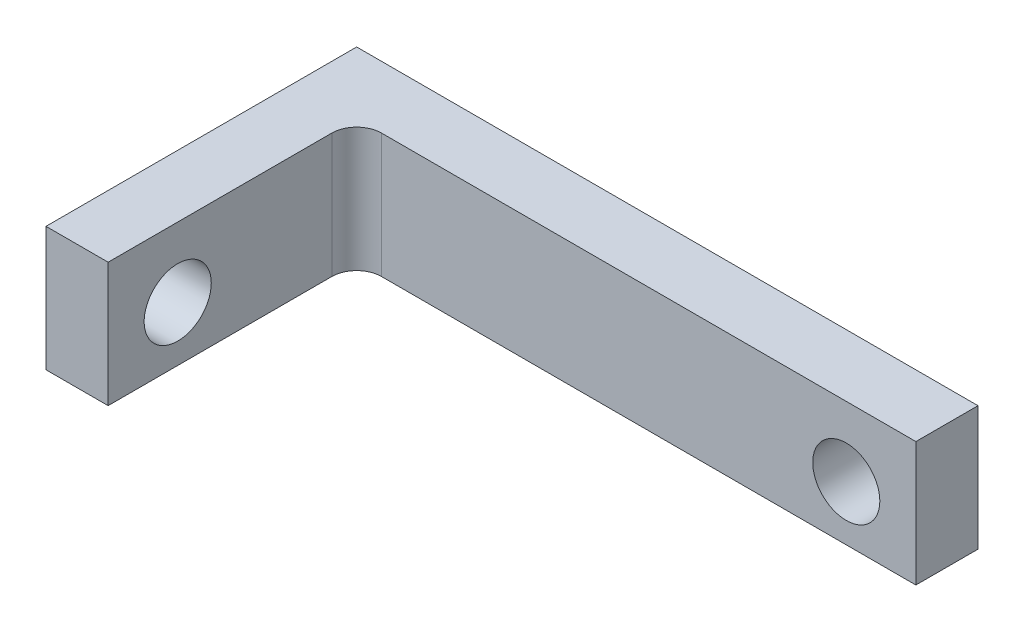
ISO-10303-21;
HEADER;
FILE_DESCRIPTION(('STEP AP214'),'2;1');
FILE_NAME('part.step','',(''),(''),'','','');
FILE_SCHEMA(('AUTOMOTIVE_DESIGN { 1 0 10303 214 1 1 1 1 }'));
ENDSEC;
DATA;
#1=APPLICATION_CONTEXT('core data for automotive mechanical design processes');
#2=APPLICATION_PROTOCOL_DEFINITION('international standard','automotive_design',2000,#1);
#3=PRODUCT_CONTEXT('',#1,'mechanical');
#4=PRODUCT('Part','Part','',(#3));
#5=PRODUCT_RELATED_PRODUCT_CATEGORY('part','',(#4));
#6=PRODUCT_DEFINITION_FORMATION('','',#4);
#7=PRODUCT_DEFINITION_CONTEXT('part definition',#1,'design');
#8=PRODUCT_DEFINITION('design','',#6,#7);
#9=PRODUCT_DEFINITION_SHAPE('','',#8);
#10=(LENGTH_UNIT() NAMED_UNIT(*) SI_UNIT(.MILLI.,.METRE.));
#11=(NAMED_UNIT(*) PLANE_ANGLE_UNIT() SI_UNIT($,.RADIAN.));
#12=(NAMED_UNIT(*) SI_UNIT($,.STERADIAN.) SOLID_ANGLE_UNIT());
#13=UNCERTAINTY_MEASURE_WITH_UNIT(LENGTH_MEASURE(1.E-05),#10,'distance_accuracy_value','');
#14=(GEOMETRIC_REPRESENTATION_CONTEXT(3) GLOBAL_UNCERTAINTY_ASSIGNED_CONTEXT((#13)) GLOBAL_UNIT_ASSIGNED_CONTEXT((#10,
#11,#12)) REPRESENTATION_CONTEXT('',''));
#15=CARTESIAN_POINT('',(0.,0.,0.));
#16=DIRECTION('',(0.,0.,1.));
#17=DIRECTION('',(1.,0.,0.));
#18=AXIS2_PLACEMENT_3D('',#15,#16,#17);
#19=CARTESIAN_POINT('',(-25.,10.,0.));
#20=DIRECTION('',(1.,0.,0.));
#21=DIRECTION('',(0.,0.,-1.));
#22=AXIS2_PLACEMENT_3D('',#19,#20,#21);
#23=PLANE('',#22);
#24=CARTESIAN_POINT('',(-25.,4.4,19.4));
#25=DIRECTION('',(1.,0.,0.));
#26=DIRECTION('',(0.,0.,-1.));
#27=AXIS2_PLACEMENT_3D('',#24,#25,#26);
#28=CIRCLE('',#27,2.7);
#29=CARTESIAN_POINT('',(-25.,4.4,16.7));
#30=VERTEX_POINT('',#29);
#31=EDGE_CURVE('E146',#30,#30,#28,.T.);
#32=ORIENTED_EDGE('',*,*,#31,.T.);
#33=EDGE_LOOP('',(#32));
#34=FACE_BOUND('',#33,.T.);
#35=DIRECTION('',(0.,0.,1.));
#36=VECTOR('',#35,1.);
#37=CARTESIAN_POINT('',(-25.,0.,0.));
#38=LINE('',#37,#36);
#39=CARTESIAN_POINT('',(-25.,0.,0.));
#40=VERTEX_POINT('',#39);
#41=CARTESIAN_POINT('',(-25.,0.,25.));
#42=VERTEX_POINT('',#41);
#43=EDGE_CURVE('E120',#40,#42,#38,.T.);
#44=ORIENTED_EDGE('',*,*,#43,.T.);
#45=DIRECTION('',(0.,-1.,0.));
#46=VECTOR('',#45,1.);
#47=CARTESIAN_POINT('',(-25.,10.,25.));
#48=LINE('',#47,#46);
#49=CARTESIAN_POINT('',(-25.,10.,25.));
#50=VERTEX_POINT('',#49);
#51=EDGE_CURVE('E102',#50,#42,#48,.T.);
#52=ORIENTED_EDGE('',*,*,#51,.F.);
#53=DIRECTION('',(0.,0.,1.));
#54=VECTOR('',#53,1.);
#55=CARTESIAN_POINT('',(-25.,10.,0.));
#56=LINE('',#55,#54);
#57=CARTESIAN_POINT('',(-25.,10.,0.));
#58=VERTEX_POINT('',#57);
#59=EDGE_CURVE('E108',#58,#50,#56,.T.);
#60=ORIENTED_EDGE('',*,*,#59,.F.);
#61=DIRECTION('',(0.,-1.,0.));
#62=VECTOR('',#61,1.);
#63=CARTESIAN_POINT('',(-25.,10.,0.));
#64=LINE('',#63,#62);
#65=EDGE_CURVE('E134',#58,#40,#64,.T.);
#66=ORIENTED_EDGE('',*,*,#65,.T.);
#67=EDGE_LOOP('',(#44,#52,#60,#66));
#68=FACE_BOUND('',#67,.T.);
#69=ADVANCED_FACE('F39',(#34,#68),#23,.F.);
#70=CARTESIAN_POINT('',(-25.,10.,25.));
#71=DIRECTION('',(0.,0.,-1.));
#72=DIRECTION('',(-1.,0.,0.));
#73=AXIS2_PLACEMENT_3D('',#70,#71,#72);
#74=PLANE('',#73);
#75=DIRECTION('',(1.,0.,0.));
#76=VECTOR('',#75,1.);
#77=CARTESIAN_POINT('',(-25.,0.,25.));
#78=LINE('',#77,#76);
#79=CARTESIAN_POINT('',(-20.,0.,25.));
#80=VERTEX_POINT('',#79);
#81=EDGE_CURVE('E143',#42,#80,#78,.T.);
#82=ORIENTED_EDGE('',*,*,#81,.T.);
#83=DIRECTION('',(0.,-1.,0.));
#84=VECTOR('',#83,1.);
#85=CARTESIAN_POINT('',(-20.,10.,25.));
#86=LINE('',#85,#84);
#87=CARTESIAN_POINT('',(-20.,10.,25.));
#88=VERTEX_POINT('',#87);
#89=EDGE_CURVE('E105',#88,#80,#86,.T.);
#90=ORIENTED_EDGE('',*,*,#89,.F.);
#91=DIRECTION('',(1.,0.,0.));
#92=VECTOR('',#91,1.);
#93=CARTESIAN_POINT('',(-25.,10.,25.));
#94=LINE('',#93,#92);
#95=EDGE_CURVE('E98',#50,#88,#94,.T.);
#96=ORIENTED_EDGE('',*,*,#95,.F.);
#97=ORIENTED_EDGE('',*,*,#51,.T.);
#98=EDGE_LOOP('',(#82,#90,#96,#97));
#99=FACE_BOUND('',#98,.T.);
#100=ADVANCED_FACE('F100',(#99),#74,.F.);
#101=CARTESIAN_POINT('',(-20.,10.,25.));
#102=DIRECTION('',(-1.,0.,0.));
#103=DIRECTION('',(0.,0.,1.));
#104=AXIS2_PLACEMENT_3D('',#101,#102,#103);
#105=PLANE('',#104);
#106=CARTESIAN_POINT('',(-20.,4.4,19.4));
#107=DIRECTION('',(1.,0.,0.));
#108=DIRECTION('',(0.,0.,-1.));
#109=AXIS2_PLACEMENT_3D('',#106,#107,#108);
#110=CIRCLE('',#109,2.7);
#111=CARTESIAN_POINT('',(-20.,4.4,16.7));
#112=VERTEX_POINT('',#111);
#113=EDGE_CURVE('E153',#112,#112,#110,.T.);
#114=ORIENTED_EDGE('',*,*,#113,.F.);
#115=EDGE_LOOP('',(#114));
#116=FACE_BOUND('',#115,.T.);
#117=DIRECTION('',(0.,0.,-1.));
#118=VECTOR('',#117,1.);
#119=CARTESIAN_POINT('',(-20.,0.,25.));
#120=LINE('',#119,#118);
#121=CARTESIAN_POINT('',(-20.,0.,7.));
#122=VERTEX_POINT('',#121);
#123=EDGE_CURVE('E141',#80,#122,#120,.T.);
#124=ORIENTED_EDGE('',*,*,#123,.T.);
#125=DIRECTION('',(0.,-1.,0.));
#126=VECTOR('',#125,1.);
#127=CARTESIAN_POINT('',(-20.,10.,7.));
#128=LINE('',#127,#126);
#129=CARTESIAN_POINT('',(-20.,10.,7.));
#130=VERTEX_POINT('',#129);
#131=EDGE_CURVE('E54',#122,#130,#128,.F.);
#132=ORIENTED_EDGE('',*,*,#131,.T.);
#133=DIRECTION('',(0.,0.,-1.));
#134=VECTOR('',#133,1.);
#135=CARTESIAN_POINT('',(-20.,10.,25.));
#136=LINE('',#135,#134);
#137=EDGE_CURVE('E107',#88,#130,#136,.T.);
#138=ORIENTED_EDGE('',*,*,#137,.F.);
#139=ORIENTED_EDGE('',*,*,#89,.T.);
#140=EDGE_LOOP('',(#124,#132,#138,#139));
#141=FACE_BOUND('',#140,.T.);
#142=ADVANCED_FACE('F179',(#116,#141),#105,.F.);
#143=CARTESIAN_POINT('',(-20.,10.,5.));
#144=DIRECTION('',(0.,0.,-1.));
#145=DIRECTION('',(-1.,0.,0.));
#146=AXIS2_PLACEMENT_3D('',#143,#144,#145);
#147=PLANE('',#146);
#148=CARTESIAN_POINT('',(19.4,4.4,5.));
#149=DIRECTION('',(0.,0.,1.));
#150=DIRECTION('',(1.,0.,0.));
#151=AXIS2_PLACEMENT_3D('',#148,#149,#150);
#152=CIRCLE('',#151,2.7);
#153=CARTESIAN_POINT('',(22.1,4.4,5.));
#154=VERTEX_POINT('',#153);
#155=EDGE_CURVE('E159',#154,#154,#152,.T.);
#156=ORIENTED_EDGE('',*,*,#155,.F.);
#157=EDGE_LOOP('',(#156));
#158=FACE_BOUND('',#157,.T.);
#159=DIRECTION('',(1.,0.,0.));
#160=VECTOR('',#159,1.);
#161=CARTESIAN_POINT('',(-20.,10.,5.));
#162=LINE('',#161,#160);
#163=CARTESIAN_POINT('',(-18.,10.,5.));
#164=VERTEX_POINT('',#163);
#165=CARTESIAN_POINT('',(25.,10.,5.));
#166=VERTEX_POINT('',#165);
#167=EDGE_CURVE('E150',#164,#166,#162,.T.);
#168=ORIENTED_EDGE('',*,*,#167,.F.);
#169=DIRECTION('',(0.,-1.,0.));
#170=VECTOR('',#169,1.);
#171=CARTESIAN_POINT('',(-18.,0.,5.));
#172=LINE('',#171,#170);
#173=CARTESIAN_POINT('',(-18.,0.,5.));
#174=VERTEX_POINT('',#173);
#175=EDGE_CURVE('E121',#164,#174,#172,.T.);
#176=ORIENTED_EDGE('',*,*,#175,.T.);
#177=DIRECTION('',(1.,0.,0.));
#178=VECTOR('',#177,1.);
#179=CARTESIAN_POINT('',(-20.,0.,5.));
#180=LINE('',#179,#178);
#181=CARTESIAN_POINT('',(25.,0.,5.));
#182=VERTEX_POINT('',#181);
#183=EDGE_CURVE('E139',#174,#182,#180,.T.);
#184=ORIENTED_EDGE('',*,*,#183,.T.);
#185=DIRECTION('',(0.,-1.,0.));
#186=VECTOR('',#185,1.);
#187=CARTESIAN_POINT('',(25.,10.,5.));
#188=LINE('',#187,#186);
#189=EDGE_CURVE('E125',#166,#182,#188,.T.);
#190=ORIENTED_EDGE('',*,*,#189,.F.);
#191=EDGE_LOOP('',(#168,#176,#184,#190));
#192=FACE_BOUND('',#191,.T.);
#193=ADVANCED_FACE('F175',(#158,#192),#147,.F.);
#194=CARTESIAN_POINT('',(25.,10.,0.));
#195=DIRECTION('',(-1.,0.,0.));
#196=DIRECTION('',(0.,0.,1.));
#197=AXIS2_PLACEMENT_3D('',#194,#195,#196);
#198=PLANE('',#197);
#199=DIRECTION('',(0.,0.,-1.));
#200=VECTOR('',#199,1.);
#201=CARTESIAN_POINT('',(25.,0.,0.));
#202=LINE('',#201,#200);
#203=CARTESIAN_POINT('',(25.,0.,0.));
#204=VERTEX_POINT('',#203);
#205=EDGE_CURVE('E137',#182,#204,#202,.T.);
#206=ORIENTED_EDGE('',*,*,#205,.T.);
#207=DIRECTION('',(0.,-1.,0.));
#208=VECTOR('',#207,1.);
#209=CARTESIAN_POINT('',(25.,10.,0.));
#210=LINE('',#209,#208);
#211=CARTESIAN_POINT('',(25.,10.,0.));
#212=VERTEX_POINT('',#211);
#213=EDGE_CURVE('E131',#212,#204,#210,.T.);
#214=ORIENTED_EDGE('',*,*,#213,.F.);
#215=DIRECTION('',(0.,0.,-1.));
#216=VECTOR('',#215,1.);
#217=CARTESIAN_POINT('',(25.,10.,0.));
#218=LINE('',#217,#216);
#219=EDGE_CURVE('E148',#166,#212,#218,.T.);
#220=ORIENTED_EDGE('',*,*,#219,.F.);
#221=ORIENTED_EDGE('',*,*,#189,.T.);
#222=EDGE_LOOP('',(#206,#214,#220,#221));
#223=FACE_BOUND('',#222,.T.);
#224=ADVANCED_FACE('F178',(#223),#198,.F.);
#225=CARTESIAN_POINT('',(-25.,10.,0.));
#226=DIRECTION('',(0.,0.,1.));
#227=DIRECTION('',(1.,0.,0.));
#228=AXIS2_PLACEMENT_3D('',#225,#226,#227);
#229=PLANE('',#228);
#230=CARTESIAN_POINT('',(19.4,4.4,0.));
#231=DIRECTION('',(0.,0.,1.));
#232=DIRECTION('',(1.,0.,0.));
#233=AXIS2_PLACEMENT_3D('',#230,#231,#232);
#234=CIRCLE('',#233,2.7);
#235=CARTESIAN_POINT('',(22.1,4.4,0.));
#236=VERTEX_POINT('',#235);
#237=EDGE_CURVE('E156',#236,#236,#234,.T.);
#238=ORIENTED_EDGE('',*,*,#237,.T.);
#239=EDGE_LOOP('',(#238));
#240=FACE_BOUND('',#239,.T.);
#241=DIRECTION('',(-1.,0.,0.));
#242=VECTOR('',#241,1.);
#243=CARTESIAN_POINT('',(-25.,0.,0.));
#244=LINE('',#243,#242);
#245=EDGE_CURVE('E117',#204,#40,#244,.T.);
#246=ORIENTED_EDGE('',*,*,#245,.T.);
#247=ORIENTED_EDGE('',*,*,#65,.F.);
#248=DIRECTION('',(-1.,0.,0.));
#249=VECTOR('',#248,1.);
#250=CARTESIAN_POINT('',(-25.,10.,0.));
#251=LINE('',#250,#249);
#252=EDGE_CURVE('E113',#212,#58,#251,.T.);
#253=ORIENTED_EDGE('',*,*,#252,.F.);
#254=ORIENTED_EDGE('',*,*,#213,.T.);
#255=EDGE_LOOP('',(#246,#247,#253,#254));
#256=FACE_BOUND('',#255,.T.);
#257=ADVANCED_FACE('F165',(#240,#256),#229,.F.);
#258=CARTESIAN_POINT('',(0.,10.,0.));
#259=DIRECTION('',(0.,1.,0.));
#260=DIRECTION('',(0.,0.,1.));
#261=AXIS2_PLACEMENT_3D('',#258,#259,#260);
#262=PLANE('',#261);
#263=ORIENTED_EDGE('',*,*,#59,.T.);
#264=ORIENTED_EDGE('',*,*,#95,.T.);
#265=ORIENTED_EDGE('',*,*,#137,.T.);
#266=CARTESIAN_POINT('',(-18.,10.,7.));
#267=DIRECTION('',(0.,1.,0.));
#268=DIRECTION('',(0.,0.,1.));
#269=AXIS2_PLACEMENT_3D('',#266,#267,#268);
#270=CIRCLE('',#269,2.);
#271=EDGE_CURVE('E11',#130,#164,#270,.F.);
#272=ORIENTED_EDGE('',*,*,#271,.T.);
#273=ORIENTED_EDGE('',*,*,#167,.T.);
#274=ORIENTED_EDGE('',*,*,#219,.T.);
#275=ORIENTED_EDGE('',*,*,#252,.T.);
#276=EDGE_LOOP('',(#263,#264,#265,#272,#273,#274,#275));
#277=FACE_BOUND('',#276,.T.);
#278=ADVANCED_FACE('F111',(#277),#262,.T.);
#279=CARTESIAN_POINT('',(0.,0.,0.));
#280=DIRECTION('',(0.,1.,0.));
#281=DIRECTION('',(0.,0.,1.));
#282=AXIS2_PLACEMENT_3D('',#279,#280,#281);
#283=PLANE('',#282);
#284=ORIENTED_EDGE('',*,*,#43,.F.);
#285=ORIENTED_EDGE('',*,*,#245,.F.);
#286=ORIENTED_EDGE('',*,*,#205,.F.);
#287=ORIENTED_EDGE('',*,*,#183,.F.);
#288=CARTESIAN_POINT('',(-18.,0.,7.));
#289=DIRECTION('',(0.,1.,0.));
#290=DIRECTION('',(0.,0.,1.));
#291=AXIS2_PLACEMENT_3D('',#288,#289,#290);
#292=CIRCLE('',#291,2.);
#293=EDGE_CURVE('E47',#174,#122,#292,.T.);
#294=ORIENTED_EDGE('',*,*,#293,.T.);
#295=ORIENTED_EDGE('',*,*,#123,.F.);
#296=ORIENTED_EDGE('',*,*,#81,.F.);
#297=EDGE_LOOP('',(#284,#285,#286,#287,#294,#295,#296));
#298=FACE_BOUND('',#297,.T.);
#299=ADVANCED_FACE('F187',(#298),#283,.F.);
#300=CARTESIAN_POINT('',(-25.,4.4,19.4));
#301=DIRECTION('',(1.,0.,0.));
#302=DIRECTION('',(0.,0.,-1.));
#303=AXIS2_PLACEMENT_3D('',#300,#301,#302);
#304=CYLINDRICAL_SURFACE('',#303,2.7);
#305=ORIENTED_EDGE('',*,*,#31,.F.);
#306=EDGE_LOOP('',(#305));
#307=FACE_BOUND('',#306,.T.);
#308=ORIENTED_EDGE('',*,*,#113,.T.);
#309=EDGE_LOOP('',(#308));
#310=FACE_BOUND('',#309,.T.);
#311=ADVANCED_FACE('F171',(#307,#310),#304,.F.);
#312=CARTESIAN_POINT('',(19.4,4.4,0.));
#313=DIRECTION('',(0.,0.,1.));
#314=DIRECTION('',(1.,0.,0.));
#315=AXIS2_PLACEMENT_3D('',#312,#313,#314);
#316=CYLINDRICAL_SURFACE('',#315,2.7);
#317=ORIENTED_EDGE('',*,*,#237,.F.);
#318=EDGE_LOOP('',(#317));
#319=FACE_BOUND('',#318,.T.);
#320=ORIENTED_EDGE('',*,*,#155,.T.);
#321=EDGE_LOOP('',(#320));
#322=FACE_BOUND('',#321,.T.);
#323=ADVANCED_FACE('F168',(#319,#322),#316,.F.);
#324=CARTESIAN_POINT('',(-18.,10.,7.));
#325=DIRECTION('',(0.,1.,0.));
#326=DIRECTION('',(0.,0.,1.));
#327=AXIS2_PLACEMENT_3D('',#324,#325,#326);
#328=CYLINDRICAL_SURFACE('',#327,2.);
#329=ORIENTED_EDGE('',*,*,#271,.F.);
#330=ORIENTED_EDGE('',*,*,#131,.F.);
#331=ORIENTED_EDGE('',*,*,#293,.F.);
#332=ORIENTED_EDGE('',*,*,#175,.F.);
#333=EDGE_LOOP('',(#329,#330,#331,#332));
#334=FACE_BOUND('',#333,.T.);
#335=ADVANCED_FACE('F41',(#334),#328,.F.);
#336=CLOSED_SHELL('',(#69,#100,#142,#193,#224,#257,#278,#299,#311,#323,#335));
#337=MANIFOLD_SOLID_BREP('B2',#336);
#338=ADVANCED_BREP_SHAPE_REPRESENTATION('',(#18,#337),#14);
#339=SHAPE_DEFINITION_REPRESENTATION(#9,#338);
ENDSEC;
END-ISO-10303-21;
